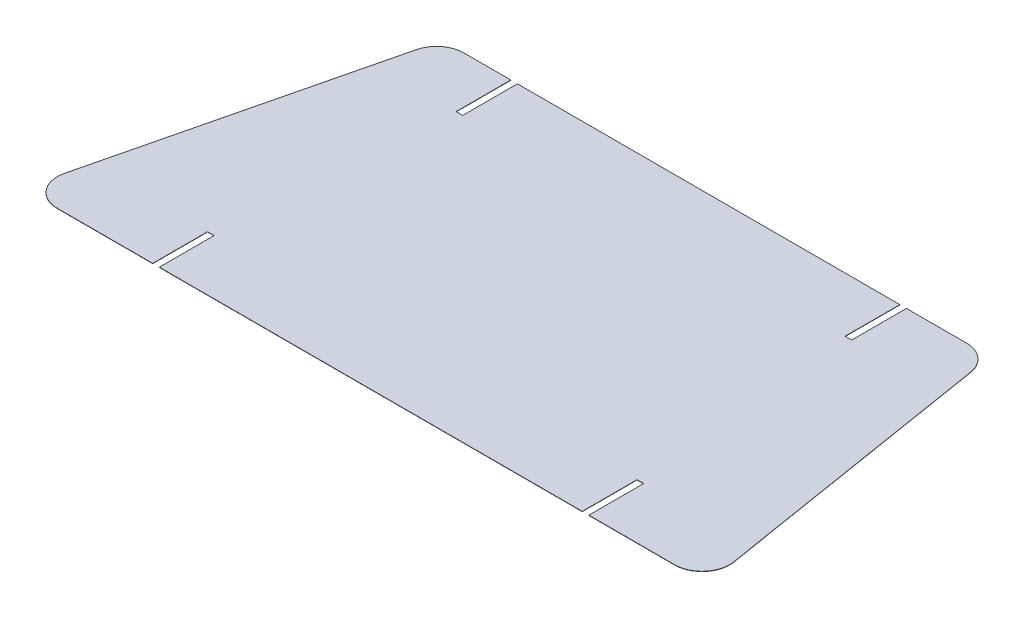
ISO-10303-21;
HEADER;
FILE_DESCRIPTION(('STEP AP214'),'2;1');
FILE_NAME('part.step','',(''),(''),'','','');
FILE_SCHEMA(('AUTOMOTIVE_DESIGN { 1 0 10303 214 1 1 1 1 }'));
ENDSEC;
DATA;
#1=APPLICATION_CONTEXT('core data for automotive mechanical design processes');
#2=APPLICATION_PROTOCOL_DEFINITION('international standard','automotive_design',2000,#1);
#3=PRODUCT_CONTEXT('',#1,'mechanical');
#4=PRODUCT('Part','Part','',(#3));
#5=PRODUCT_RELATED_PRODUCT_CATEGORY('part','',(#4));
#6=PRODUCT_DEFINITION_FORMATION('','',#4);
#7=PRODUCT_DEFINITION_CONTEXT('part definition',#1,'design');
#8=PRODUCT_DEFINITION('design','',#6,#7);
#9=PRODUCT_DEFINITION_SHAPE('','',#8);
#10=(LENGTH_UNIT() NAMED_UNIT(*) SI_UNIT(.MILLI.,.METRE.));
#11=(NAMED_UNIT(*) PLANE_ANGLE_UNIT() SI_UNIT($,.RADIAN.));
#12=(NAMED_UNIT(*) SI_UNIT($,.STERADIAN.) SOLID_ANGLE_UNIT());
#13=UNCERTAINTY_MEASURE_WITH_UNIT(LENGTH_MEASURE(1.E-05),#10,'distance_accuracy_value','');
#14=(GEOMETRIC_REPRESENTATION_CONTEXT(3) GLOBAL_UNCERTAINTY_ASSIGNED_CONTEXT((#13)) GLOBAL_UNIT_ASSIGNED_CONTEXT((#10,
#11,#12)) REPRESENTATION_CONTEXT('',''));
#15=CARTESIAN_POINT('',(0.,0.,0.));
#16=DIRECTION('',(0.,0.,1.));
#17=DIRECTION('',(1.,0.,0.));
#18=AXIS2_PLACEMENT_3D('',#15,#16,#17);
#19=CARTESIAN_POINT('',(-17.4307099381782,0.02,-10.345509667761));
#20=DIRECTION('',(0.,-1.,0.));
#21=DIRECTION('',(0.,0.,-1.));
#22=AXIS2_PLACEMENT_3D('',#19,#20,#21);
#23=CYLINDRICAL_SURFACE('',#22,2.);
#24=CARTESIAN_POINT('',(-17.4307099381782,0.,-10.345509667761));
#25=DIRECTION('',(0.,1.,0.));
#26=DIRECTION('',(0.,0.,1.));
#27=AXIS2_PLACEMENT_3D('',#24,#25,#26);
#28=CIRCLE('',#27,2.);
#29=CARTESIAN_POINT('',(-19.3741446889928,0.,-10.8178033998029));
#30=VERTEX_POINT('',#29);
#31=CARTESIAN_POINT('',(-17.4307099381781,0.,-12.345509667761));
#32=VERTEX_POINT('',#31);
#33=EDGE_CURVE('E228',#30,#32,#28,.F.);
#34=ORIENTED_EDGE('',*,*,#33,.F.);
#35=DIRECTION('',(0.,-1.,0.));
#36=VECTOR('',#35,1.);
#37=CARTESIAN_POINT('',(-19.3741446889928,0.02,-10.8178033998029));
#38=LINE('',#37,#36);
#39=CARTESIAN_POINT('',(-19.3741446889928,0.02,-10.8178033998029));
#40=VERTEX_POINT('',#39);
#41=EDGE_CURVE('E11',#40,#30,#38,.T.);
#42=ORIENTED_EDGE('',*,*,#41,.F.);
#43=CARTESIAN_POINT('',(-17.4307099381782,0.02,-10.345509667761));
#44=DIRECTION('',(0.,1.,0.));
#45=DIRECTION('',(0.,0.,1.));
#46=AXIS2_PLACEMENT_3D('',#43,#44,#45);
#47=CIRCLE('',#46,2.);
#48=CARTESIAN_POINT('',(-17.4307099381781,0.02,-12.345509667761));
#49=VERTEX_POINT('',#48);
#50=EDGE_CURVE('E288',#40,#49,#47,.F.);
#51=ORIENTED_EDGE('',*,*,#50,.T.);
#52=DIRECTION('',(0.,-1.,0.));
#53=VECTOR('',#52,1.);
#54=CARTESIAN_POINT('',(-17.4307099381781,0.02,-12.345509667761));
#55=LINE('',#54,#53);
#56=EDGE_CURVE('E55',#49,#32,#55,.T.);
#57=ORIENTED_EDGE('',*,*,#56,.T.);
#58=EDGE_LOOP('',(#34,#42,#51,#57));
#59=FACE_BOUND('',#58,.T.);
#60=ADVANCED_FACE('F39',(#59),#23,.T.);
#61=CARTESIAN_POINT('',(-20.7760787276995,0.02,-5.04900499252079));
#62=DIRECTION('',(-0.971717375407317,0.,-0.236146866020949));
#63=DIRECTION('',(-0.236146866020949,0.,0.971717375407317));
#64=AXIS2_PLACEMENT_3D('',#61,#62,#63);
#65=PLANE('',#64);
#66=DIRECTION('',(0.236146866020949,0.,-0.971717375407317));
#67=VECTOR('',#66,1.);
#68=CARTESIAN_POINT('',(-20.7760787276995,0.,-5.04900499252079));
#69=LINE('',#68,#67);
#70=CARTESIAN_POINT('',(-24.3991828987722,0.,9.85965475496739));
#71=VERTEX_POINT('',#70);
#72=EDGE_CURVE('E230',#71,#30,#69,.T.);
#73=ORIENTED_EDGE('',*,*,#72,.F.);
#74=DIRECTION('',(0.,-1.,0.));
#75=VECTOR('',#74,1.);
#76=CARTESIAN_POINT('',(-24.3991828987722,0.02,9.85965475496739));
#77=LINE('',#76,#75);
#78=CARTESIAN_POINT('',(-24.3991828987722,0.02,9.85965475496739));
#79=VERTEX_POINT('',#78);
#80=EDGE_CURVE('E47',#79,#71,#77,.T.);
#81=ORIENTED_EDGE('',*,*,#80,.F.);
#82=DIRECTION('',(0.236146866020949,0.,-0.971717375407317));
#83=VECTOR('',#82,1.);
#84=CARTESIAN_POINT('',(-20.7760787276995,0.02,-5.04900499252079));
#85=LINE('',#84,#83);
#86=EDGE_CURVE('E355',#79,#40,#85,.T.);
#87=ORIENTED_EDGE('',*,*,#86,.T.);
#88=ORIENTED_EDGE('',*,*,#41,.T.);
#89=EDGE_LOOP('',(#73,#81,#87,#88));
#90=FACE_BOUND('',#89,.T.);
#91=ADVANCED_FACE('F341',(#90),#65,.T.);
#92=CARTESIAN_POINT('',(-22.4557481479575,0.02,10.3319484870093));
#93=DIRECTION('',(0.,-1.,0.));
#94=DIRECTION('',(0.,0.,-1.));
#95=AXIS2_PLACEMENT_3D('',#92,#93,#94);
#96=CYLINDRICAL_SURFACE('',#95,2.);
#97=CARTESIAN_POINT('',(-22.4557481479575,0.,10.3319484870093));
#98=DIRECTION('',(0.,1.,0.));
#99=DIRECTION('',(0.,0.,1.));
#100=AXIS2_PLACEMENT_3D('',#97,#98,#99);
#101=CIRCLE('',#100,2.);
#102=CARTESIAN_POINT('',(-22.4557481479575,0.,12.3319484870093));
#103=VERTEX_POINT('',#102);
#104=EDGE_CURVE('E233',#103,#71,#101,.F.);
#105=ORIENTED_EDGE('',*,*,#104,.F.);
#106=DIRECTION('',(0.,-1.,0.));
#107=VECTOR('',#106,1.);
#108=CARTESIAN_POINT('',(-22.4557481479575,0.02,12.3319484870093));
#109=LINE('',#108,#107);
#110=CARTESIAN_POINT('',(-22.4557481479575,0.02,12.3319484870093));
#111=VERTEX_POINT('',#110);
#112=EDGE_CURVE('E330',#111,#103,#109,.T.);
#113=ORIENTED_EDGE('',*,*,#112,.F.);
#114=CARTESIAN_POINT('',(-22.4557481479575,0.02,10.3319484870093));
#115=DIRECTION('',(0.,1.,0.));
#116=DIRECTION('',(0.,0.,1.));
#117=AXIS2_PLACEMENT_3D('',#114,#115,#116);
#118=CIRCLE('',#117,2.);
#119=EDGE_CURVE('E337',#111,#79,#118,.F.);
#120=ORIENTED_EDGE('',*,*,#119,.T.);
#121=ORIENTED_EDGE('',*,*,#80,.T.);
#122=EDGE_LOOP('',(#105,#113,#120,#121));
#123=FACE_BOUND('',#122,.T.);
#124=ADVANCED_FACE('F335',(#123),#96,.T.);
#125=CARTESIAN_POINT('',(0.,0.02,12.3319484870093));
#126=DIRECTION('',(0.,0.,-1.));
#127=DIRECTION('',(-1.,0.,0.));
#128=AXIS2_PLACEMENT_3D('',#125,#126,#127);
#129=PLANE('',#128);
#130=DIRECTION('',(1.,0.,0.));
#131=VECTOR('',#130,1.);
#132=CARTESIAN_POINT('',(0.,0.,12.3319484870093));
#133=LINE('',#132,#131);
#134=CARTESIAN_POINT('',(-15.482,0.,12.3319484870093));
#135=VERTEX_POINT('',#134);
#136=EDGE_CURVE('E236',#103,#135,#133,.T.);
#137=ORIENTED_EDGE('',*,*,#136,.T.);
#138=DIRECTION('',(0.,-1.,0.));
#139=VECTOR('',#138,1.);
#140=CARTESIAN_POINT('',(-15.482,0.02,12.3319484870093));
#141=LINE('',#140,#139);
#142=CARTESIAN_POINT('',(-15.482,0.02,12.3319484870093));
#143=VERTEX_POINT('',#142);
#144=EDGE_CURVE('E328',#143,#135,#141,.T.);
#145=ORIENTED_EDGE('',*,*,#144,.F.);
#146=DIRECTION('',(1.,0.,0.));
#147=VECTOR('',#146,1.);
#148=CARTESIAN_POINT('',(0.,0.02,12.3319484870093));
#149=LINE('',#148,#147);
#150=EDGE_CURVE('E351',#111,#143,#149,.T.);
#151=ORIENTED_EDGE('',*,*,#150,.F.);
#152=ORIENTED_EDGE('',*,*,#112,.T.);
#153=EDGE_LOOP('',(#137,#145,#151,#152));
#154=FACE_BOUND('',#153,.T.);
#155=ADVANCED_FACE('F348',(#154),#129,.F.);
#156=CARTESIAN_POINT('',(-15.482,0.02,0.));
#157=DIRECTION('',(1.,0.,0.));
#158=DIRECTION('',(0.,0.,-1.));
#159=AXIS2_PLACEMENT_3D('',#156,#157,#158);
#160=PLANE('',#159);
#161=DIRECTION('',(0.,0.,1.));
#162=VECTOR('',#161,1.);
#163=CARTESIAN_POINT('',(-15.482,0.,0.));
#164=LINE('',#163,#162);
#165=CARTESIAN_POINT('',(-15.482,0.,8.3319484870093));
#166=VERTEX_POINT('',#165);
#167=EDGE_CURVE('E239',#166,#135,#164,.T.);
#168=ORIENTED_EDGE('',*,*,#167,.F.);
#169=DIRECTION('',(0.,-1.,0.));
#170=VECTOR('',#169,1.);
#171=CARTESIAN_POINT('',(-15.482,0.02,8.3319484870093));
#172=LINE('',#171,#170);
#173=CARTESIAN_POINT('',(-15.482,0.02,8.3319484870093));
#174=VERTEX_POINT('',#173);
#175=EDGE_CURVE('E326',#174,#166,#172,.T.);
#176=ORIENTED_EDGE('',*,*,#175,.F.);
#177=DIRECTION('',(0.,0.,1.));
#178=VECTOR('',#177,1.);
#179=CARTESIAN_POINT('',(-15.482,0.02,0.));
#180=LINE('',#179,#178);
#181=EDGE_CURVE('E353',#174,#143,#180,.T.);
#182=ORIENTED_EDGE('',*,*,#181,.T.);
#183=ORIENTED_EDGE('',*,*,#144,.T.);
#184=EDGE_LOOP('',(#168,#176,#182,#183));
#185=FACE_BOUND('',#184,.T.);
#186=ADVANCED_FACE('F602',(#185),#160,.T.);
#187=CARTESIAN_POINT('',(0.,0.02,8.33194848700936));
#188=DIRECTION('',(0.,0.,1.));
#189=DIRECTION('',(1.,0.,0.));
#190=AXIS2_PLACEMENT_3D('',#187,#188,#189);
#191=PLANE('',#190);
#192=DIRECTION('',(-1.,0.,0.));
#193=VECTOR('',#192,1.);
#194=CARTESIAN_POINT('',(0.,0.,8.33194848700936));
#195=LINE('',#194,#193);
#196=CARTESIAN_POINT('',(-15.,0.,8.33194848700931));
#197=VERTEX_POINT('',#196);
#198=EDGE_CURVE('E242',#197,#166,#195,.T.);
#199=ORIENTED_EDGE('',*,*,#198,.F.);
#200=DIRECTION('',(0.,-1.,0.));
#201=VECTOR('',#200,1.);
#202=CARTESIAN_POINT('',(-15.,0.02,8.33194848700931));
#203=LINE('',#202,#201);
#204=CARTESIAN_POINT('',(-15.,0.02,8.33194848700931));
#205=VERTEX_POINT('',#204);
#206=EDGE_CURVE('E324',#205,#197,#203,.T.);
#207=ORIENTED_EDGE('',*,*,#206,.F.);
#208=DIRECTION('',(-1.,0.,0.));
#209=VECTOR('',#208,1.);
#210=CARTESIAN_POINT('',(0.,0.02,8.33194848700936));
#211=LINE('',#210,#209);
#212=EDGE_CURVE('E361',#205,#174,#211,.T.);
#213=ORIENTED_EDGE('',*,*,#212,.T.);
#214=ORIENTED_EDGE('',*,*,#175,.T.);
#215=EDGE_LOOP('',(#199,#207,#213,#214));
#216=FACE_BOUND('',#215,.T.);
#217=ADVANCED_FACE('F591',(#216),#191,.T.);
#218=CARTESIAN_POINT('',(-15.,0.02,0.));
#219=DIRECTION('',(-1.,0.,0.));
#220=DIRECTION('',(0.,0.,1.));
#221=AXIS2_PLACEMENT_3D('',#218,#219,#220);
#222=PLANE('',#221);
#223=DIRECTION('',(0.,0.,-1.));
#224=VECTOR('',#223,1.);
#225=CARTESIAN_POINT('',(-15.,0.,0.));
#226=LINE('',#225,#224);
#227=CARTESIAN_POINT('',(-15.,0.,12.3319484870093));
#228=VERTEX_POINT('',#227);
#229=EDGE_CURVE('E245',#228,#197,#226,.T.);
#230=ORIENTED_EDGE('',*,*,#229,.F.);
#231=DIRECTION('',(0.,-1.,0.));
#232=VECTOR('',#231,1.);
#233=CARTESIAN_POINT('',(-15.,0.02,12.3319484870093));
#234=LINE('',#233,#232);
#235=CARTESIAN_POINT('',(-15.,0.02,12.3319484870093));
#236=VERTEX_POINT('',#235);
#237=EDGE_CURVE('E322',#236,#228,#234,.T.);
#238=ORIENTED_EDGE('',*,*,#237,.F.);
#239=DIRECTION('',(0.,0.,-1.));
#240=VECTOR('',#239,1.);
#241=CARTESIAN_POINT('',(-15.,0.02,0.));
#242=LINE('',#241,#240);
#243=EDGE_CURVE('E364',#236,#205,#242,.T.);
#244=ORIENTED_EDGE('',*,*,#243,.T.);
#245=ORIENTED_EDGE('',*,*,#206,.T.);
#246=EDGE_LOOP('',(#230,#238,#244,#245));
#247=FACE_BOUND('',#246,.T.);
#248=ADVANCED_FACE('F582',(#247),#222,.T.);
#249=CARTESIAN_POINT('',(0.,0.02,12.3319484870093));
#250=DIRECTION('',(0.,0.,-1.));
#251=DIRECTION('',(-1.,0.,0.));
#252=AXIS2_PLACEMENT_3D('',#249,#250,#251);
#253=PLANE('',#252);
#254=DIRECTION('',(1.,0.,0.));
#255=VECTOR('',#254,1.);
#256=CARTESIAN_POINT('',(0.,0.,12.3319484870093));
#257=LINE('',#256,#255);
#258=CARTESIAN_POINT('',(15.8932307547238,0.,12.3319484870093));
#259=VERTEX_POINT('',#258);
#260=EDGE_CURVE('E248',#228,#259,#257,.T.);
#261=ORIENTED_EDGE('',*,*,#260,.T.);
#262=DIRECTION('',(0.,-1.,0.));
#263=VECTOR('',#262,1.);
#264=CARTESIAN_POINT('',(15.8932307547238,0.02,12.3319484870093));
#265=LINE('',#264,#263);
#266=CARTESIAN_POINT('',(15.8932307547238,0.02,12.3319484870093));
#267=VERTEX_POINT('',#266);
#268=EDGE_CURVE('E320',#267,#259,#265,.T.);
#269=ORIENTED_EDGE('',*,*,#268,.F.);
#270=DIRECTION('',(1.,0.,0.));
#271=VECTOR('',#270,1.);
#272=CARTESIAN_POINT('',(0.,0.02,12.3319484870093));
#273=LINE('',#272,#271);
#274=EDGE_CURVE('E367',#236,#267,#273,.T.);
#275=ORIENTED_EDGE('',*,*,#274,.F.);
#276=ORIENTED_EDGE('',*,*,#237,.T.);
#277=EDGE_LOOP('',(#261,#269,#275,#276));
#278=FACE_BOUND('',#277,.T.);
#279=ADVANCED_FACE('F544',(#278),#253,.F.);
#280=CARTESIAN_POINT('',(15.8932307547238,0.02,0.));
#281=DIRECTION('',(1.,0.,0.));
#282=DIRECTION('',(0.,0.,-1.));
#283=AXIS2_PLACEMENT_3D('',#280,#281,#282);
#284=PLANE('',#283);
#285=DIRECTION('',(0.,0.,1.));
#286=VECTOR('',#285,1.);
#287=CARTESIAN_POINT('',(15.8932307547238,0.,0.));
#288=LINE('',#287,#286);
#289=CARTESIAN_POINT('',(15.8932307547238,0.,8.3319484870093));
#290=VERTEX_POINT('',#289);
#291=EDGE_CURVE('E251',#290,#259,#288,.T.);
#292=ORIENTED_EDGE('',*,*,#291,.F.);
#293=DIRECTION('',(0.,-1.,0.));
#294=VECTOR('',#293,1.);
#295=CARTESIAN_POINT('',(15.8932307547238,0.02,8.3319484870093));
#296=LINE('',#295,#294);
#297=CARTESIAN_POINT('',(15.8932307547238,0.02,8.3319484870093));
#298=VERTEX_POINT('',#297);
#299=EDGE_CURVE('E318',#298,#290,#296,.T.);
#300=ORIENTED_EDGE('',*,*,#299,.F.);
#301=DIRECTION('',(0.,0.,1.));
#302=VECTOR('',#301,1.);
#303=CARTESIAN_POINT('',(15.8932307547238,0.02,0.));
#304=LINE('',#303,#302);
#305=EDGE_CURVE('E369',#298,#267,#304,.T.);
#306=ORIENTED_EDGE('',*,*,#305,.T.);
#307=ORIENTED_EDGE('',*,*,#268,.T.);
#308=EDGE_LOOP('',(#292,#300,#306,#307));
#309=FACE_BOUND('',#308,.T.);
#310=ADVANCED_FACE('F562',(#309),#284,.T.);
#311=CARTESIAN_POINT('',(0.,0.02,8.3319484870093));
#312=DIRECTION('',(0.,0.,-1.));
#313=DIRECTION('',(-1.,0.,0.));
#314=AXIS2_PLACEMENT_3D('',#311,#312,#313);
#315=PLANE('',#314);
#316=DIRECTION('',(1.,0.,0.));
#317=VECTOR('',#316,1.);
#318=CARTESIAN_POINT('',(0.,0.,8.3319484870093));
#319=LINE('',#318,#317);
#320=CARTESIAN_POINT('',(16.3752307547238,0.,8.3319484870093));
#321=VERTEX_POINT('',#320);
#322=EDGE_CURVE('E255',#290,#321,#319,.T.);
#323=ORIENTED_EDGE('',*,*,#322,.T.);
#324=DIRECTION('',(0.,-1.,0.));
#325=VECTOR('',#324,1.);
#326=CARTESIAN_POINT('',(16.3752307547238,0.02,8.3319484870093));
#327=LINE('',#326,#325);
#328=CARTESIAN_POINT('',(16.3752307547238,0.02,8.3319484870093));
#329=VERTEX_POINT('',#328);
#330=EDGE_CURVE('E315',#329,#321,#327,.T.);
#331=ORIENTED_EDGE('',*,*,#330,.F.);
#332=DIRECTION('',(1.,0.,0.));
#333=VECTOR('',#332,1.);
#334=CARTESIAN_POINT('',(0.,0.02,8.3319484870093));
#335=LINE('',#334,#333);
#336=EDGE_CURVE('E373',#298,#329,#335,.T.);
#337=ORIENTED_EDGE('',*,*,#336,.F.);
#338=ORIENTED_EDGE('',*,*,#299,.T.);
#339=EDGE_LOOP('',(#323,#331,#337,#338));
#340=FACE_BOUND('',#339,.T.);
#341=ADVANCED_FACE('F552',(#340),#315,.F.);
#342=CARTESIAN_POINT('',(16.3752307547238,0.02,0.));
#343=DIRECTION('',(1.,0.,0.));
#344=DIRECTION('',(0.,0.,-1.));
#345=AXIS2_PLACEMENT_3D('',#342,#343,#344);
#346=PLANE('',#345);
#347=DIRECTION('',(0.,0.,1.));
#348=VECTOR('',#347,1.);
#349=CARTESIAN_POINT('',(16.3752307547238,0.,0.));
#350=LINE('',#349,#348);
#351=CARTESIAN_POINT('',(16.3752307547238,0.,12.3319484870093));
#352=VERTEX_POINT('',#351);
#353=EDGE_CURVE('E257',#321,#352,#350,.T.);
#354=ORIENTED_EDGE('',*,*,#353,.T.);
#355=DIRECTION('',(0.,-1.,0.));
#356=VECTOR('',#355,1.);
#357=CARTESIAN_POINT('',(16.3752307547238,0.02,12.3319484870093));
#358=LINE('',#357,#356);
#359=CARTESIAN_POINT('',(16.3752307547238,0.02,12.3319484870093));
#360=VERTEX_POINT('',#359);
#361=EDGE_CURVE('E312',#360,#352,#358,.T.);
#362=ORIENTED_EDGE('',*,*,#361,.F.);
#363=DIRECTION('',(0.,0.,1.));
#364=VECTOR('',#363,1.);
#365=CARTESIAN_POINT('',(16.3752307547238,0.02,0.));
#366=LINE('',#365,#364);
#367=EDGE_CURVE('E375',#329,#360,#366,.T.);
#368=ORIENTED_EDGE('',*,*,#367,.F.);
#369=ORIENTED_EDGE('',*,*,#330,.T.);
#370=EDGE_LOOP('',(#354,#362,#368,#369));
#371=FACE_BOUND('',#370,.T.);
#372=ADVANCED_FACE('F541',(#371),#346,.F.);
#373=CARTESIAN_POINT('',(22.6494433780187,0.,12.3319484870093));
#374=VERTEX_POINT('',#373);
#375=EDGE_CURVE('E252',#352,#374,#257,.T.);
#376=ORIENTED_EDGE('',*,*,#375,.T.);
#377=DIRECTION('',(0.,-1.,0.));
#378=VECTOR('',#377,1.);
#379=CARTESIAN_POINT('',(22.6494433780187,0.02,12.3319484870093));
#380=LINE('',#379,#378);
#381=CARTESIAN_POINT('',(22.6494433780187,0.02,12.3319484870093));
#382=VERTEX_POINT('',#381);
#383=EDGE_CURVE('E310',#382,#374,#380,.T.);
#384=ORIENTED_EDGE('',*,*,#383,.F.);
#385=EDGE_CURVE('E370',#360,#382,#273,.T.);
#386=ORIENTED_EDGE('',*,*,#385,.F.);
#387=ORIENTED_EDGE('',*,*,#361,.T.);
#388=EDGE_LOOP('',(#376,#384,#386,#387));
#389=FACE_BOUND('',#388,.T.);
#390=ADVANCED_FACE('F531',(#389),#253,.F.);
#391=CARTESIAN_POINT('',(22.6494433780188,0.02,10.3319484870093));
#392=DIRECTION('',(0.,-1.,0.));
#393=DIRECTION('',(0.,0.,-1.));
#394=AXIS2_PLACEMENT_3D('',#391,#392,#393);
#395=CYLINDRICAL_SURFACE('',#394,2.);
#396=CARTESIAN_POINT('',(22.6494433780188,0.,10.3319484870093));
#397=DIRECTION('',(0.,1.,0.));
#398=DIRECTION('',(0.,0.,1.));
#399=AXIS2_PLACEMENT_3D('',#396,#397,#398);
#400=CIRCLE('',#399,2.);
#401=CARTESIAN_POINT('',(24.6236400304004,0.,10.0117179798349));
#402=VERTEX_POINT('',#401);
#403=EDGE_CURVE('E259',#402,#374,#400,.F.);
#404=ORIENTED_EDGE('',*,*,#403,.F.);
#405=DIRECTION('',(0.,-1.,0.));
#406=VECTOR('',#405,1.);
#407=CARTESIAN_POINT('',(24.6236400304004,0.02,10.0117179798349));
#408=LINE('',#407,#406);
#409=CARTESIAN_POINT('',(24.6236400304004,0.02,10.0117179798349));
#410=VERTEX_POINT('',#409);
#411=EDGE_CURVE('E308',#410,#402,#408,.T.);
#412=ORIENTED_EDGE('',*,*,#411,.F.);
#413=CARTESIAN_POINT('',(22.6494433780188,0.02,10.3319484870093));
#414=DIRECTION('',(0.,1.,0.));
#415=DIRECTION('',(0.,0.,1.));
#416=AXIS2_PLACEMENT_3D('',#413,#414,#415);
#417=CIRCLE('',#416,2.);
#418=EDGE_CURVE('E377',#410,#382,#417,.F.);
#419=ORIENTED_EDGE('',*,*,#418,.T.);
#420=ORIENTED_EDGE('',*,*,#383,.T.);
#421=EDGE_LOOP('',(#404,#412,#419,#420));
#422=FACE_BOUND('',#421,.T.);
#423=ADVANCED_FACE('F521',(#422),#395,.T.);
#424=CARTESIAN_POINT('',(22.4100193614512,0.02,-3.6350846088452));
#425=DIRECTION('',(-0.987098326190812,0.,0.160115253587212));
#426=DIRECTION('',(0.160115253587212,0.,0.987098326190812));
#427=AXIS2_PLACEMENT_3D('',#424,#425,#426);
#428=PLANE('',#427);
#429=DIRECTION('',(-0.160115253587212,0.,-0.987098326190812));
#430=VECTOR('',#429,1.);
#431=CARTESIAN_POINT('',(22.4100193614512,0.,-3.6350846088452));
#432=LINE('',#431,#430);
#433=CARTESIAN_POINT('',(21.2695907243234,0.,-10.6657401749354));
#434=VERTEX_POINT('',#433);
#435=EDGE_CURVE('E262',#402,#434,#432,.T.);
#436=ORIENTED_EDGE('',*,*,#435,.T.);
#437=DIRECTION('',(0.,-1.,0.));
#438=VECTOR('',#437,1.);
#439=CARTESIAN_POINT('',(21.2695907243234,0.02,-10.6657401749354));
#440=LINE('',#439,#438);
#441=CARTESIAN_POINT('',(21.2695907243234,0.02,-10.6657401749354));
#442=VERTEX_POINT('',#441);
#443=EDGE_CURVE('E305',#442,#434,#440,.T.);
#444=ORIENTED_EDGE('',*,*,#443,.F.);
#445=DIRECTION('',(-0.160115253587212,0.,-0.987098326190812));
#446=VECTOR('',#445,1.);
#447=CARTESIAN_POINT('',(22.4100193614512,0.02,-3.6350846088452));
#448=LINE('',#447,#446);
#449=EDGE_CURVE('E380',#410,#442,#448,.T.);
#450=ORIENTED_EDGE('',*,*,#449,.F.);
#451=ORIENTED_EDGE('',*,*,#411,.T.);
#452=EDGE_LOOP('',(#436,#444,#450,#451));
#453=FACE_BOUND('',#452,.T.);
#454=ADVANCED_FACE('F511',(#453),#428,.F.);
#455=CARTESIAN_POINT('',(19.2953940719418,0.02,-10.345509667761));
#456=DIRECTION('',(0.,-1.,0.));
#457=DIRECTION('',(0.,0.,-1.));
#458=AXIS2_PLACEMENT_3D('',#455,#456,#457);
#459=CYLINDRICAL_SURFACE('',#458,2.);
#460=CARTESIAN_POINT('',(19.2953940719418,0.,-10.345509667761));
#461=DIRECTION('',(0.,1.,0.));
#462=DIRECTION('',(0.,0.,1.));
#463=AXIS2_PLACEMENT_3D('',#460,#461,#462);
#464=CIRCLE('',#463,2.);
#465=CARTESIAN_POINT('',(19.2953940719418,0.,-12.345509667761));
#466=VERTEX_POINT('',#465);
#467=EDGE_CURVE('E264',#434,#466,#464,.T.);
#468=ORIENTED_EDGE('',*,*,#467,.T.);
#469=DIRECTION('',(0.,-1.,0.));
#470=VECTOR('',#469,1.);
#471=CARTESIAN_POINT('',(19.2953940719418,0.02,-12.345509667761));
#472=LINE('',#471,#470);
#473=CARTESIAN_POINT('',(19.2953940719418,0.02,-12.345509667761));
#474=VERTEX_POINT('',#473);
#475=EDGE_CURVE('E303',#474,#466,#472,.T.);
#476=ORIENTED_EDGE('',*,*,#475,.F.);
#477=CARTESIAN_POINT('',(19.2953940719418,0.02,-10.345509667761));
#478=DIRECTION('',(0.,1.,0.));
#479=DIRECTION('',(0.,0.,1.));
#480=AXIS2_PLACEMENT_3D('',#477,#478,#479);
#481=CIRCLE('',#480,2.);
#482=EDGE_CURVE('E382',#442,#474,#481,.T.);
#483=ORIENTED_EDGE('',*,*,#482,.F.);
#484=ORIENTED_EDGE('',*,*,#443,.T.);
#485=EDGE_LOOP('',(#468,#476,#483,#484));
#486=FACE_BOUND('',#485,.T.);
#487=ADVANCED_FACE('F502',(#486),#459,.T.);
#488=CARTESIAN_POINT('',(0.,0.02,-12.345509667761));
#489=DIRECTION('',(0.,0.,-1.));
#490=DIRECTION('',(-1.,0.,0.));
#491=AXIS2_PLACEMENT_3D('',#488,#489,#490);
#492=PLANE('',#491);
#493=DIRECTION('',(1.,0.,0.));
#494=VECTOR('',#493,1.);
#495=CARTESIAN_POINT('',(0.,0.,-12.345509667761));
#496=LINE('',#495,#494);
#497=CARTESIAN_POINT('',(14.8961120944041,0.,-12.345509667761));
#498=VERTEX_POINT('',#497);
#499=EDGE_CURVE('E267',#498,#466,#496,.T.);
#500=ORIENTED_EDGE('',*,*,#499,.F.);
#501=DIRECTION('',(0.,-1.,0.));
#502=VECTOR('',#501,1.);
#503=CARTESIAN_POINT('',(14.8961120944041,0.02,-12.345509667761));
#504=LINE('',#503,#502);
#505=CARTESIAN_POINT('',(14.8961120944041,0.02,-12.345509667761));
#506=VERTEX_POINT('',#505);
#507=EDGE_CURVE('E301',#506,#498,#504,.T.);
#508=ORIENTED_EDGE('',*,*,#507,.F.);
#509=DIRECTION('',(1.,0.,0.));
#510=VECTOR('',#509,1.);
#511=CARTESIAN_POINT('',(0.,0.02,-12.345509667761));
#512=LINE('',#511,#510);
#513=EDGE_CURVE('E384',#506,#474,#512,.T.);
#514=ORIENTED_EDGE('',*,*,#513,.T.);
#515=ORIENTED_EDGE('',*,*,#475,.T.);
#516=EDGE_LOOP('',(#500,#508,#514,#515));
#517=FACE_BOUND('',#516,.T.);
#518=ADVANCED_FACE('F417',(#517),#492,.T.);
#519=CARTESIAN_POINT('',(14.8961120944041,0.02,0.));
#520=DIRECTION('',(1.,0.,0.));
#521=DIRECTION('',(0.,0.,-1.));
#522=AXIS2_PLACEMENT_3D('',#519,#520,#521);
#523=PLANE('',#522);
#524=DIRECTION('',(0.,0.,1.));
#525=VECTOR('',#524,1.);
#526=CARTESIAN_POINT('',(14.8961120944041,0.,0.));
#527=LINE('',#526,#525);
#528=CARTESIAN_POINT('',(14.8961120944041,0.,-8.34550966776101));
#529=VERTEX_POINT('',#528);
#530=EDGE_CURVE('E270',#498,#529,#527,.T.);
#531=ORIENTED_EDGE('',*,*,#530,.T.);
#532=DIRECTION('',(0.,-1.,0.));
#533=VECTOR('',#532,1.);
#534=CARTESIAN_POINT('',(14.8961120944041,0.02,-8.34550966776101));
#535=LINE('',#534,#533);
#536=CARTESIAN_POINT('',(14.8961120944041,0.02,-8.34550966776101));
#537=VERTEX_POINT('',#536);
#538=EDGE_CURVE('E298',#537,#529,#535,.T.);
#539=ORIENTED_EDGE('',*,*,#538,.F.);
#540=DIRECTION('',(0.,0.,1.));
#541=VECTOR('',#540,1.);
#542=CARTESIAN_POINT('',(14.8961120944041,0.02,0.));
#543=LINE('',#542,#541);
#544=EDGE_CURVE('E387',#506,#537,#543,.T.);
#545=ORIENTED_EDGE('',*,*,#544,.F.);
#546=ORIENTED_EDGE('',*,*,#507,.T.);
#547=EDGE_LOOP('',(#531,#539,#545,#546));
#548=FACE_BOUND('',#547,.T.);
#549=ADVANCED_FACE('F483',(#548),#523,.F.);
#550=CARTESIAN_POINT('',(0.,0.02,-8.34550966776101));
#551=DIRECTION('',(0.,0.,1.));
#552=DIRECTION('',(1.,0.,0.));
#553=AXIS2_PLACEMENT_3D('',#550,#551,#552);
#554=PLANE('',#553);
#555=DIRECTION('',(-1.,0.,0.));
#556=VECTOR('',#555,1.);
#557=CARTESIAN_POINT('',(0.,0.,-8.34550966776101));
#558=LINE('',#557,#556);
#559=CARTESIAN_POINT('',(14.4141120944041,0.,-8.34550966776101));
#560=VERTEX_POINT('',#559);
#561=EDGE_CURVE('E273',#529,#560,#558,.T.);
#562=ORIENTED_EDGE('',*,*,#561,.T.);
#563=DIRECTION('',(0.,-1.,0.));
#564=VECTOR('',#563,1.);
#565=CARTESIAN_POINT('',(14.4141120944041,0.02,-8.34550966776101));
#566=LINE('',#565,#564);
#567=CARTESIAN_POINT('',(14.4141120944041,0.02,-8.34550966776101));
#568=VERTEX_POINT('',#567);
#569=EDGE_CURVE('E296',#568,#560,#566,.T.);
#570=ORIENTED_EDGE('',*,*,#569,.F.);
#571=DIRECTION('',(-1.,0.,0.));
#572=VECTOR('',#571,1.);
#573=CARTESIAN_POINT('',(0.,0.02,-8.34550966776101));
#574=LINE('',#573,#572);
#575=EDGE_CURVE('E390',#537,#568,#574,.T.);
#576=ORIENTED_EDGE('',*,*,#575,.F.);
#577=ORIENTED_EDGE('',*,*,#538,.T.);
#578=EDGE_LOOP('',(#562,#570,#576,#577));
#579=FACE_BOUND('',#578,.T.);
#580=ADVANCED_FACE('F474',(#579),#554,.F.);
#581=CARTESIAN_POINT('',(14.4141120944041,0.02,0.));
#582=DIRECTION('',(1.,0.,0.));
#583=DIRECTION('',(0.,0.,-1.));
#584=AXIS2_PLACEMENT_3D('',#581,#582,#583);
#585=PLANE('',#584);
#586=DIRECTION('',(0.,0.,1.));
#587=VECTOR('',#586,1.);
#588=CARTESIAN_POINT('',(14.4141120944041,0.,0.));
#589=LINE('',#588,#587);
#590=CARTESIAN_POINT('',(14.4141120944041,0.,-12.345509667761));
#591=VERTEX_POINT('',#590);
#592=EDGE_CURVE('E276',#591,#560,#589,.T.);
#593=ORIENTED_EDGE('',*,*,#592,.F.);
#594=DIRECTION('',(0.,-1.,0.));
#595=VECTOR('',#594,1.);
#596=CARTESIAN_POINT('',(14.4141120944041,0.02,-12.345509667761));
#597=LINE('',#596,#595);
#598=CARTESIAN_POINT('',(14.4141120944041,0.02,-12.345509667761));
#599=VERTEX_POINT('',#598);
#600=EDGE_CURVE('E294',#599,#591,#597,.T.);
#601=ORIENTED_EDGE('',*,*,#600,.F.);
#602=DIRECTION('',(0.,0.,1.));
#603=VECTOR('',#602,1.);
#604=CARTESIAN_POINT('',(14.4141120944041,0.02,0.));
#605=LINE('',#604,#603);
#606=EDGE_CURVE('E392',#599,#568,#605,.T.);
#607=ORIENTED_EDGE('',*,*,#606,.T.);
#608=ORIENTED_EDGE('',*,*,#569,.T.);
#609=EDGE_LOOP('',(#593,#601,#607,#608));
#610=FACE_BOUND('',#609,.T.);
#611=ADVANCED_FACE('F403',(#610),#585,.T.);
#612=CARTESIAN_POINT('',(-13.5208813396803,0.,-12.345509667761));
#613=VERTEX_POINT('',#612);
#614=EDGE_CURVE('E271',#613,#591,#496,.T.);
#615=ORIENTED_EDGE('',*,*,#614,.F.);
#616=DIRECTION('',(0.,-1.,0.));
#617=VECTOR('',#616,1.);
#618=CARTESIAN_POINT('',(-13.5208813396803,0.02,-12.345509667761));
#619=LINE('',#618,#617);
#620=CARTESIAN_POINT('',(-13.5208813396803,0.02,-12.345509667761));
#621=VERTEX_POINT('',#620);
#622=EDGE_CURVE('E292',#621,#613,#619,.T.);
#623=ORIENTED_EDGE('',*,*,#622,.F.);
#624=EDGE_CURVE('E388',#621,#599,#512,.T.);
#625=ORIENTED_EDGE('',*,*,#624,.T.);
#626=ORIENTED_EDGE('',*,*,#600,.T.);
#627=EDGE_LOOP('',(#615,#623,#625,#626));
#628=FACE_BOUND('',#627,.T.);
#629=ADVANCED_FACE('F397',(#628),#492,.T.);
#630=CARTESIAN_POINT('',(-13.5208813396803,0.02,0.));
#631=DIRECTION('',(1.,0.,0.));
#632=DIRECTION('',(0.,0.,-1.));
#633=AXIS2_PLACEMENT_3D('',#630,#631,#632);
#634=PLANE('',#633);
#635=DIRECTION('',(0.,0.,1.));
#636=VECTOR('',#635,1.);
#637=CARTESIAN_POINT('',(-13.5208813396803,0.,0.));
#638=LINE('',#637,#636);
#639=CARTESIAN_POINT('',(-13.5208813396803,0.,-8.34550966776101));
#640=VERTEX_POINT('',#639);
#641=EDGE_CURVE('E279',#613,#640,#638,.T.);
#642=ORIENTED_EDGE('',*,*,#641,.T.);
#643=DIRECTION('',(0.,-1.,0.));
#644=VECTOR('',#643,1.);
#645=CARTESIAN_POINT('',(-13.5208813396803,0.02,-8.34550966776101));
#646=LINE('',#645,#644);
#647=CARTESIAN_POINT('',(-13.5208813396803,0.02,-8.34550966776101));
#648=VERTEX_POINT('',#647);
#649=EDGE_CURVE('E210',#648,#640,#646,.T.);
#650=ORIENTED_EDGE('',*,*,#649,.F.);
#651=DIRECTION('',(0.,0.,1.));
#652=VECTOR('',#651,1.);
#653=CARTESIAN_POINT('',(-13.5208813396803,0.02,0.));
#654=LINE('',#653,#652);
#655=EDGE_CURVE('E219',#621,#648,#654,.T.);
#656=ORIENTED_EDGE('',*,*,#655,.F.);
#657=ORIENTED_EDGE('',*,*,#622,.T.);
#658=EDGE_LOOP('',(#642,#650,#656,#657));
#659=FACE_BOUND('',#658,.T.);
#660=ADVANCED_FACE('F408',(#659),#634,.F.);
#661=CARTESIAN_POINT('',(0.,0.02,-8.34550966776101));
#662=DIRECTION('',(0.,0.,-1.));
#663=DIRECTION('',(-1.,0.,0.));
#664=AXIS2_PLACEMENT_3D('',#661,#662,#663);
#665=PLANE('',#664);
#666=DIRECTION('',(1.,0.,0.));
#667=VECTOR('',#666,1.);
#668=CARTESIAN_POINT('',(0.,0.,-8.34550966776101));
#669=LINE('',#668,#667);
#670=CARTESIAN_POINT('',(-14.0028813396803,0.,-8.34550966776101));
#671=VERTEX_POINT('',#670);
#672=EDGE_CURVE('E206',#671,#640,#669,.T.);
#673=ORIENTED_EDGE('',*,*,#672,.F.);
#674=DIRECTION('',(0.,-1.,0.));
#675=VECTOR('',#674,1.);
#676=CARTESIAN_POINT('',(-14.0028813396803,0.02,-8.34550966776101));
#677=LINE('',#676,#675);
#678=CARTESIAN_POINT('',(-14.0028813396803,0.02,-8.34550966776101));
#679=VERTEX_POINT('',#678);
#680=EDGE_CURVE('E201',#679,#671,#677,.T.);
#681=ORIENTED_EDGE('',*,*,#680,.F.);
#682=DIRECTION('',(1.,0.,0.));
#683=VECTOR('',#682,1.);
#684=CARTESIAN_POINT('',(0.,0.02,-8.34550966776101));
#685=LINE('',#684,#683);
#686=EDGE_CURVE('E204',#679,#648,#685,.T.);
#687=ORIENTED_EDGE('',*,*,#686,.T.);
#688=ORIENTED_EDGE('',*,*,#649,.T.);
#689=EDGE_LOOP('',(#673,#681,#687,#688));
#690=FACE_BOUND('',#689,.T.);
#691=ADVANCED_FACE('F203',(#690),#665,.T.);
#692=CARTESIAN_POINT('',(-14.0028813396803,0.02,0.));
#693=DIRECTION('',(1.,0.,0.));
#694=DIRECTION('',(0.,0.,-1.));
#695=AXIS2_PLACEMENT_3D('',#692,#693,#694);
#696=PLANE('',#695);
#697=DIRECTION('',(0.,0.,1.));
#698=VECTOR('',#697,1.);
#699=CARTESIAN_POINT('',(-14.0028813396803,0.,0.));
#700=LINE('',#699,#698);
#701=CARTESIAN_POINT('',(-14.0028813396803,0.,-12.345509667761));
#702=VERTEX_POINT('',#701);
#703=EDGE_CURVE('E283',#702,#671,#700,.T.);
#704=ORIENTED_EDGE('',*,*,#703,.F.);
#705=DIRECTION('',(0.,-1.,0.));
#706=VECTOR('',#705,1.);
#707=CARTESIAN_POINT('',(-14.0028813396803,0.02,-12.345509667761));
#708=LINE('',#707,#706);
#709=CARTESIAN_POINT('',(-14.0028813396803,0.02,-12.345509667761));
#710=VERTEX_POINT('',#709);
#711=EDGE_CURVE('E128',#710,#702,#708,.T.);
#712=ORIENTED_EDGE('',*,*,#711,.F.);
#713=DIRECTION('',(0.,0.,1.));
#714=VECTOR('',#713,1.);
#715=CARTESIAN_POINT('',(-14.0028813396803,0.02,0.));
#716=LINE('',#715,#714);
#717=EDGE_CURVE('E216',#710,#679,#716,.T.);
#718=ORIENTED_EDGE('',*,*,#717,.T.);
#719=ORIENTED_EDGE('',*,*,#680,.T.);
#720=EDGE_LOOP('',(#704,#712,#718,#719));
#721=FACE_BOUND('',#720,.T.);
#722=ADVANCED_FACE('F222',(#721),#696,.T.);
#723=CARTESIAN_POINT('',(0.,0.02,-12.345509667761));
#724=DIRECTION('',(0.,0.,-1.));
#725=DIRECTION('',(-1.,0.,0.));
#726=AXIS2_PLACEMENT_3D('',#723,#724,#725);
#727=PLANE('',#726);
#728=DIRECTION('',(1.,0.,0.));
#729=VECTOR('',#728,1.);
#730=CARTESIAN_POINT('',(0.,0.,-12.345509667761));
#731=LINE('',#730,#729);
#732=EDGE_CURVE('E285',#32,#702,#731,.T.);
#733=ORIENTED_EDGE('',*,*,#732,.F.);
#734=ORIENTED_EDGE('',*,*,#56,.F.);
#735=DIRECTION('',(1.,0.,0.));
#736=VECTOR('',#735,1.);
#737=CARTESIAN_POINT('',(0.,0.02,-12.345509667761));
#738=LINE('',#737,#736);
#739=EDGE_CURVE('E223',#49,#710,#738,.T.);
#740=ORIENTED_EDGE('',*,*,#739,.T.);
#741=ORIENTED_EDGE('',*,*,#711,.T.);
#742=EDGE_LOOP('',(#733,#734,#740,#741));
#743=FACE_BOUND('',#742,.T.);
#744=ADVANCED_FACE('F422',(#743),#727,.T.);
#745=CARTESIAN_POINT('',(0.,0.02,0.));
#746=DIRECTION('',(0.,1.,0.));
#747=DIRECTION('',(0.,0.,1.));
#748=AXIS2_PLACEMENT_3D('',#745,#746,#747);
#749=PLANE('',#748);
#750=ORIENTED_EDGE('',*,*,#50,.F.);
#751=ORIENTED_EDGE('',*,*,#86,.F.);
#752=ORIENTED_EDGE('',*,*,#119,.F.);
#753=ORIENTED_EDGE('',*,*,#150,.T.);
#754=ORIENTED_EDGE('',*,*,#181,.F.);
#755=ORIENTED_EDGE('',*,*,#212,.F.);
#756=ORIENTED_EDGE('',*,*,#243,.F.);
#757=ORIENTED_EDGE('',*,*,#274,.T.);
#758=ORIENTED_EDGE('',*,*,#305,.F.);
#759=ORIENTED_EDGE('',*,*,#336,.T.);
#760=ORIENTED_EDGE('',*,*,#367,.T.);
#761=ORIENTED_EDGE('',*,*,#385,.T.);
#762=ORIENTED_EDGE('',*,*,#418,.F.);
#763=ORIENTED_EDGE('',*,*,#449,.T.);
#764=ORIENTED_EDGE('',*,*,#482,.T.);
#765=ORIENTED_EDGE('',*,*,#513,.F.);
#766=ORIENTED_EDGE('',*,*,#544,.T.);
#767=ORIENTED_EDGE('',*,*,#575,.T.);
#768=ORIENTED_EDGE('',*,*,#606,.F.);
#769=ORIENTED_EDGE('',*,*,#624,.F.);
#770=ORIENTED_EDGE('',*,*,#655,.T.);
#771=ORIENTED_EDGE('',*,*,#686,.F.);
#772=ORIENTED_EDGE('',*,*,#717,.F.);
#773=ORIENTED_EDGE('',*,*,#739,.F.);
#774=EDGE_LOOP('',(#750,#751,#752,#753,#754,#755,#756,#757,#758,#759,#760,#761,#762,#763,#764,
#765,#766,#767,#768,#769,#770,#771,#772,#773));
#775=FACE_BOUND('',#774,.T.);
#776=ADVANCED_FACE('F214',(#775),#749,.T.);
#777=CARTESIAN_POINT('',(0.,0.,0.));
#778=DIRECTION('',(0.,1.,0.));
#779=DIRECTION('',(0.,0.,1.));
#780=AXIS2_PLACEMENT_3D('',#777,#778,#779);
#781=PLANE('',#780);
#782=ORIENTED_EDGE('',*,*,#33,.T.);
#783=ORIENTED_EDGE('',*,*,#732,.T.);
#784=ORIENTED_EDGE('',*,*,#703,.T.);
#785=ORIENTED_EDGE('',*,*,#672,.T.);
#786=ORIENTED_EDGE('',*,*,#641,.F.);
#787=ORIENTED_EDGE('',*,*,#614,.T.);
#788=ORIENTED_EDGE('',*,*,#592,.T.);
#789=ORIENTED_EDGE('',*,*,#561,.F.);
#790=ORIENTED_EDGE('',*,*,#530,.F.);
#791=ORIENTED_EDGE('',*,*,#499,.T.);
#792=ORIENTED_EDGE('',*,*,#467,.F.);
#793=ORIENTED_EDGE('',*,*,#435,.F.);
#794=ORIENTED_EDGE('',*,*,#403,.T.);
#795=ORIENTED_EDGE('',*,*,#375,.F.);
#796=ORIENTED_EDGE('',*,*,#353,.F.);
#797=ORIENTED_EDGE('',*,*,#322,.F.);
#798=ORIENTED_EDGE('',*,*,#291,.T.);
#799=ORIENTED_EDGE('',*,*,#260,.F.);
#800=ORIENTED_EDGE('',*,*,#229,.T.);
#801=ORIENTED_EDGE('',*,*,#198,.T.);
#802=ORIENTED_EDGE('',*,*,#167,.T.);
#803=ORIENTED_EDGE('',*,*,#136,.F.);
#804=ORIENTED_EDGE('',*,*,#104,.T.);
#805=ORIENTED_EDGE('',*,*,#72,.T.);
#806=EDGE_LOOP('',(#782,#783,#784,#785,#786,#787,#788,#789,#790,#791,#792,#793,#794,#795,#796,
#797,#798,#799,#800,#801,#802,#803,#804,#805));
#807=FACE_BOUND('',#806,.T.);
#808=ADVANCED_FACE('F344',(#807),#781,.F.);
#809=CLOSED_SHELL('',(#60,#91,#124,#155,#186,#217,#248,#279,#310,#341,#372,#390,#423,#454,#487,
#518,#549,#580,#611,#629,#660,#691,#722,#744,#776,#808));
#810=MANIFOLD_SOLID_BREP('B2',#809);
#811=ADVANCED_BREP_SHAPE_REPRESENTATION('',(#18,#810),#14);
#812=SHAPE_DEFINITION_REPRESENTATION(#9,#811);
ENDSEC;
END-ISO-10303-21;
